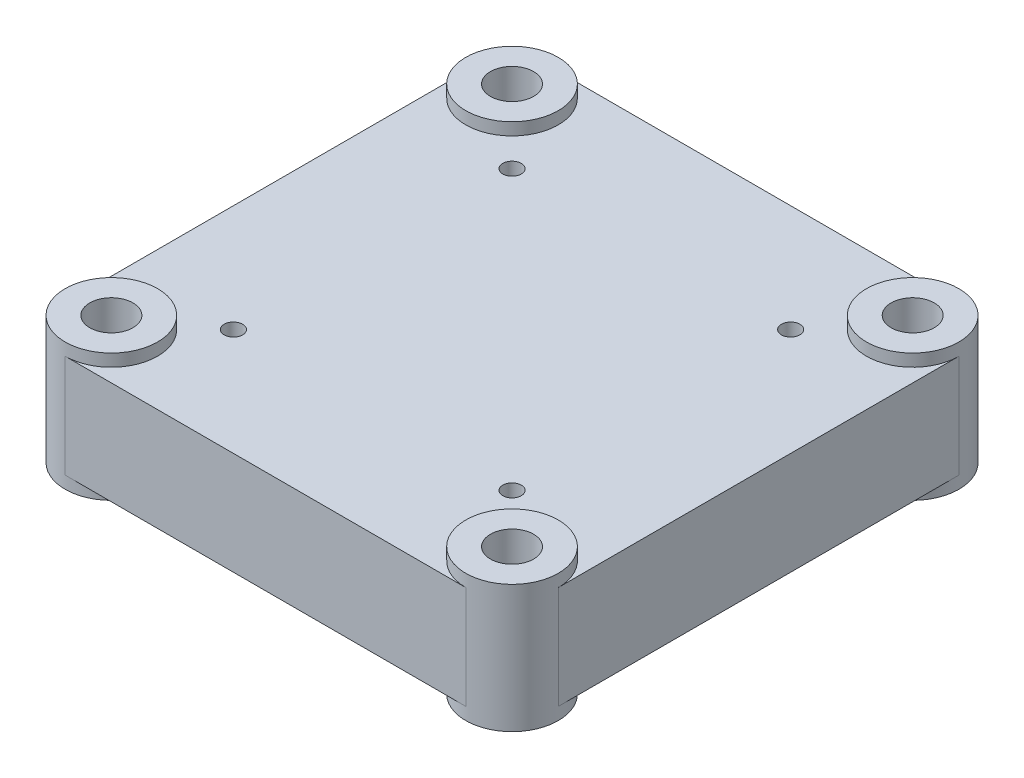
ISO-10303-21;
HEADER;
FILE_DESCRIPTION(('STEP AP214'),'2;1');
FILE_NAME('part.step','',(''),(''),'','','');
FILE_SCHEMA(('AUTOMOTIVE_DESIGN { 1 0 10303 214 1 1 1 1 }'));
ENDSEC;
DATA;
#1=APPLICATION_CONTEXT('core data for automotive mechanical design processes');
#2=APPLICATION_PROTOCOL_DEFINITION('international standard','automotive_design',2000,#1);
#3=PRODUCT_CONTEXT('',#1,'mechanical');
#4=PRODUCT('Part','Part','',(#3));
#5=PRODUCT_RELATED_PRODUCT_CATEGORY('part','',(#4));
#6=PRODUCT_DEFINITION_FORMATION('','',#4);
#7=PRODUCT_DEFINITION_CONTEXT('part definition',#1,'design');
#8=PRODUCT_DEFINITION('design','',#6,#7);
#9=PRODUCT_DEFINITION_SHAPE('','',#8);
#10=(LENGTH_UNIT() NAMED_UNIT(*) SI_UNIT(.MILLI.,.METRE.));
#11=(NAMED_UNIT(*) PLANE_ANGLE_UNIT() SI_UNIT($,.RADIAN.));
#12=(NAMED_UNIT(*) SI_UNIT($,.STERADIAN.) SOLID_ANGLE_UNIT());
#13=UNCERTAINTY_MEASURE_WITH_UNIT(LENGTH_MEASURE(1.E-05),#10,'distance_accuracy_value','');
#14=(GEOMETRIC_REPRESENTATION_CONTEXT(3) GLOBAL_UNCERTAINTY_ASSIGNED_CONTEXT((#13)) GLOBAL_UNIT_ASSIGNED_CONTEXT((#10,
#11,#12)) REPRESENTATION_CONTEXT('',''));
#15=CARTESIAN_POINT('',(0.,0.,0.));
#16=DIRECTION('',(0.,0.,1.));
#17=DIRECTION('',(1.,0.,0.));
#18=AXIS2_PLACEMENT_3D('',#15,#16,#17);
#19=CARTESIAN_POINT('',(-32.5,0.,32.5));
#20=DIRECTION('',(0.,-1.,0.));
#21=DIRECTION('',(0.,0.,-1.));
#22=AXIS2_PLACEMENT_3D('',#19,#20,#21);
#23=PLANE('',#22);
#24=CARTESIAN_POINT('',(0.,0.,0.));
#25=DIRECTION('',(0.,-1.,0.));
#26=DIRECTION('',(0.,0.,-1.));
#27=AXIS2_PLACEMENT_3D('',#24,#25,#26);
#28=CIRCLE('',#27,17.4);
#29=CARTESIAN_POINT('',(0.,0.,-17.4));
#30=VERTEX_POINT('',#29);
#31=EDGE_CURVE('E227',#30,#30,#28,.T.);
#32=ORIENTED_EDGE('',*,*,#31,.F.);
#33=EDGE_LOOP('',(#32));
#34=FACE_BOUND('',#33,.T.);
#35=CARTESIAN_POINT('',(-22.6005050633883,0.,-22.6005050633883));
#36=DIRECTION('',(0.,1.,0.));
#37=DIRECTION('',(0.,0.,1.));
#38=AXIS2_PLACEMENT_3D('',#35,#36,#37);
#39=CIRCLE('',#38,1.5);
#40=CARTESIAN_POINT('',(-22.6005050633883,0.,-21.1005050633883));
#41=VERTEX_POINT('',#40);
#42=EDGE_CURVE('E187',#41,#41,#39,.T.);
#43=ORIENTED_EDGE('',*,*,#42,.T.);
#44=EDGE_LOOP('',(#43));
#45=FACE_BOUND('',#44,.T.);
#46=CARTESIAN_POINT('',(22.6005050633883,0.,22.6005050633883));
#47=DIRECTION('',(0.,1.,0.));
#48=DIRECTION('',(0.,0.,1.));
#49=AXIS2_PLACEMENT_3D('',#46,#47,#48);
#50=CIRCLE('',#49,1.5);
#51=CARTESIAN_POINT('',(22.6005050633883,0.,24.1005050633883));
#52=VERTEX_POINT('',#51);
#53=EDGE_CURVE('E167',#52,#52,#50,.T.);
#54=ORIENTED_EDGE('',*,*,#53,.T.);
#55=EDGE_LOOP('',(#54));
#56=FACE_BOUND('',#55,.T.);
#57=CARTESIAN_POINT('',(-22.6005050633883,0.,22.6005050633883));
#58=DIRECTION('',(0.,1.,0.));
#59=DIRECTION('',(0.,0.,-1.));
#60=AXIS2_PLACEMENT_3D('',#57,#58,#59);
#61=CIRCLE('',#60,1.5);
#62=CARTESIAN_POINT('',(-22.6005050633883,0.,21.1005050633883));
#63=VERTEX_POINT('',#62);
#64=EDGE_CURVE('E181',#63,#63,#61,.T.);
#65=ORIENTED_EDGE('',*,*,#64,.T.);
#66=EDGE_LOOP('',(#65));
#67=FACE_BOUND('',#66,.T.);
#68=CARTESIAN_POINT('',(22.6005050633883,0.,-22.6005050633883));
#69=DIRECTION('',(0.,1.,0.));
#70=DIRECTION('',(0.,0.,-1.));
#71=AXIS2_PLACEMENT_3D('',#68,#69,#70);
#72=CIRCLE('',#71,1.5);
#73=CARTESIAN_POINT('',(22.6005050633883,0.,-24.1005050633883));
#74=VERTEX_POINT('',#73);
#75=EDGE_CURVE('E193',#74,#74,#72,.T.);
#76=ORIENTED_EDGE('',*,*,#75,.T.);
#77=EDGE_LOOP('',(#76));
#78=FACE_BOUND('',#77,.T.);
#79=DIRECTION('',(0.,0.,1.));
#80=VECTOR('',#79,1.);
#81=CARTESIAN_POINT('',(-40.,0.,32.5));
#82=LINE('',#81,#80);
#83=CARTESIAN_POINT('',(-40.,0.,-32.4999999999999));
#84=VERTEX_POINT('',#83);
#85=CARTESIAN_POINT('',(-40.,0.,32.5));
#86=VERTEX_POINT('',#85);
#87=EDGE_CURVE('E114',#84,#86,#82,.T.);
#88=ORIENTED_EDGE('',*,*,#87,.F.);
#89=CARTESIAN_POINT('',(-32.5,0.,-32.5));
#90=DIRECTION('',(0.,-1.,0.));
#91=DIRECTION('',(0.,0.,-1.));
#92=AXIS2_PLACEMENT_3D('',#89,#90,#91);
#93=CIRCLE('',#92,7.5);
#94=CARTESIAN_POINT('',(-32.5,0.,-40.));
#95=VERTEX_POINT('',#94);
#96=EDGE_CURVE('E80',#95,#84,#93,.T.);
#97=ORIENTED_EDGE('',*,*,#96,.F.);
#98=DIRECTION('',(-1.,0.,0.));
#99=VECTOR('',#98,1.);
#100=CARTESIAN_POINT('',(-32.5,0.,-40.));
#101=LINE('',#100,#99);
#102=CARTESIAN_POINT('',(32.4999999999999,0.,-40.));
#103=VERTEX_POINT('',#102);
#104=EDGE_CURVE('E112',#103,#95,#101,.T.);
#105=ORIENTED_EDGE('',*,*,#104,.F.);
#106=CARTESIAN_POINT('',(32.5,0.,-32.5));
#107=DIRECTION('',(0.,-1.,0.));
#108=DIRECTION('',(0.,0.,-1.));
#109=AXIS2_PLACEMENT_3D('',#106,#107,#108);
#110=CIRCLE('',#109,7.5);
#111=CARTESIAN_POINT('',(40.,0.,-32.4999999999999));
#112=VERTEX_POINT('',#111);
#113=EDGE_CURVE('E72',#112,#103,#110,.T.);
#114=ORIENTED_EDGE('',*,*,#113,.F.);
#115=DIRECTION('',(0.,0.,-1.));
#116=VECTOR('',#115,1.);
#117=CARTESIAN_POINT('',(40.,0.,32.5));
#118=LINE('',#117,#116);
#119=CARTESIAN_POINT('',(40.,0.,32.5));
#120=VERTEX_POINT('',#119);
#121=EDGE_CURVE('E125',#120,#112,#118,.T.);
#122=ORIENTED_EDGE('',*,*,#121,.F.);
#123=CARTESIAN_POINT('',(32.5,0.,32.5));
#124=DIRECTION('',(0.,-1.,0.));
#125=DIRECTION('',(0.,0.,-1.));
#126=AXIS2_PLACEMENT_3D('',#123,#124,#125);
#127=CIRCLE('',#126,7.5);
#128=CARTESIAN_POINT('',(32.4999999999999,0.,40.));
#129=VERTEX_POINT('',#128);
#130=EDGE_CURVE('E161',#129,#120,#127,.T.);
#131=ORIENTED_EDGE('',*,*,#130,.F.);
#132=DIRECTION('',(1.,0.,0.));
#133=VECTOR('',#132,1.);
#134=CARTESIAN_POINT('',(-32.5,0.,40.));
#135=LINE('',#134,#133);
#136=CARTESIAN_POINT('',(-32.5,0.,40.));
#137=VERTEX_POINT('',#136);
#138=EDGE_CURVE('E150',#137,#129,#135,.T.);
#139=ORIENTED_EDGE('',*,*,#138,.F.);
#140=CARTESIAN_POINT('',(-32.5,0.,32.5));
#141=DIRECTION('',(0.,-1.,0.));
#142=DIRECTION('',(0.,0.,-1.));
#143=AXIS2_PLACEMENT_3D('',#140,#141,#142);
#144=CIRCLE('',#143,7.5);
#145=EDGE_CURVE('E156',#86,#137,#144,.T.);
#146=ORIENTED_EDGE('',*,*,#145,.F.);
#147=EDGE_LOOP('',(#88,#97,#105,#114,#122,#131,#139,#146));
#148=FACE_BOUND('',#147,.T.);
#149=ADVANCED_FACE('F35',(#34,#45,#56,#67,#78,#148),#23,.T.);
#150=CARTESIAN_POINT('',(-32.5,16.7,32.5));
#151=DIRECTION('',(0.,-1.,0.));
#152=DIRECTION('',(0.,0.,-1.));
#153=AXIS2_PLACEMENT_3D('',#150,#151,#152);
#154=PLANE('',#153);
#155=DIRECTION('',(-1.,0.,0.));
#156=VECTOR('',#155,1.);
#157=CARTESIAN_POINT('',(-32.5,16.7,-40.));
#158=LINE('',#157,#156);
#159=CARTESIAN_POINT('',(32.4999999999999,16.7,-40.));
#160=VERTEX_POINT('',#159);
#161=CARTESIAN_POINT('',(-32.5,16.7,-40.));
#162=VERTEX_POINT('',#161);
#163=EDGE_CURVE('E172',#160,#162,#158,.T.);
#164=ORIENTED_EDGE('',*,*,#163,.T.);
#165=CARTESIAN_POINT('',(-32.5,16.7,-32.5));
#166=DIRECTION('',(0.,-1.,0.));
#167=DIRECTION('',(0.,0.,-1.));
#168=AXIS2_PLACEMENT_3D('',#165,#166,#167);
#169=CIRCLE('',#168,7.5);
#170=CARTESIAN_POINT('',(-40.,16.7,-32.5));
#171=VERTEX_POINT('',#170);
#172=EDGE_CURVE('E129',#162,#171,#169,.T.);
#173=ORIENTED_EDGE('',*,*,#172,.T.);
#174=DIRECTION('',(0.,0.,1.));
#175=VECTOR('',#174,1.);
#176=CARTESIAN_POINT('',(-40.,16.7,32.5));
#177=LINE('',#176,#175);
#178=CARTESIAN_POINT('',(-40.,16.7,32.5));
#179=VERTEX_POINT('',#178);
#180=EDGE_CURVE('E53',#171,#179,#177,.T.);
#181=ORIENTED_EDGE('',*,*,#180,.T.);
#182=CARTESIAN_POINT('',(-32.5,16.7,32.5));
#183=DIRECTION('',(0.,-1.,0.));
#184=DIRECTION('',(0.,0.,-1.));
#185=AXIS2_PLACEMENT_3D('',#182,#183,#184);
#186=CIRCLE('',#185,7.5);
#187=CARTESIAN_POINT('',(-32.5,16.7,40.));
#188=VERTEX_POINT('',#187);
#189=EDGE_CURVE('E155',#179,#188,#186,.T.);
#190=ORIENTED_EDGE('',*,*,#189,.T.);
#191=DIRECTION('',(1.,0.,0.));
#192=VECTOR('',#191,1.);
#193=CARTESIAN_POINT('',(-32.5,16.7,40.));
#194=LINE('',#193,#192);
#195=CARTESIAN_POINT('',(32.4999999999999,16.7,40.));
#196=VERTEX_POINT('',#195);
#197=EDGE_CURVE('E86',#188,#196,#194,.T.);
#198=ORIENTED_EDGE('',*,*,#197,.T.);
#199=CARTESIAN_POINT('',(32.5,16.7,32.5));
#200=DIRECTION('',(0.,-1.,0.));
#201=DIRECTION('',(0.,0.,-1.));
#202=AXIS2_PLACEMENT_3D('',#199,#200,#201);
#203=CIRCLE('',#202,7.5);
#204=CARTESIAN_POINT('',(40.,16.7,32.5));
#205=VERTEX_POINT('',#204);
#206=EDGE_CURVE('E205',#196,#205,#203,.T.);
#207=ORIENTED_EDGE('',*,*,#206,.T.);
#208=DIRECTION('',(0.,0.,-1.));
#209=VECTOR('',#208,1.);
#210=CARTESIAN_POINT('',(40.,16.7,32.5));
#211=LINE('',#210,#209);
#212=CARTESIAN_POINT('',(40.,16.7,-32.5));
#213=VERTEX_POINT('',#212);
#214=EDGE_CURVE('E173',#205,#213,#211,.T.);
#215=ORIENTED_EDGE('',*,*,#214,.T.);
#216=CARTESIAN_POINT('',(32.5,16.7,-32.5));
#217=DIRECTION('',(0.,-1.,0.));
#218=DIRECTION('',(0.,0.,-1.));
#219=AXIS2_PLACEMENT_3D('',#216,#217,#218);
#220=CIRCLE('',#219,7.5);
#221=EDGE_CURVE('E11',#213,#160,#220,.T.);
#222=ORIENTED_EDGE('',*,*,#221,.T.);
#223=EDGE_LOOP('',(#164,#173,#181,#190,#198,#207,#215,#222));
#224=FACE_BOUND('',#223,.T.);
#225=CARTESIAN_POINT('',(22.6005050633883,16.7,22.6005050633883));
#226=DIRECTION('',(0.,1.,0.));
#227=DIRECTION('',(0.,0.,1.));
#228=AXIS2_PLACEMENT_3D('',#225,#226,#227);
#229=CIRCLE('',#228,1.5);
#230=CARTESIAN_POINT('',(22.6005050633883,16.7,24.1005050633883));
#231=VERTEX_POINT('',#230);
#232=EDGE_CURVE('E162',#231,#231,#229,.T.);
#233=ORIENTED_EDGE('',*,*,#232,.F.);
#234=EDGE_LOOP('',(#233));
#235=FACE_BOUND('',#234,.T.);
#236=CARTESIAN_POINT('',(-22.6005050633883,16.7,22.6005050633883));
#237=DIRECTION('',(0.,1.,0.));
#238=DIRECTION('',(0.,0.,-1.));
#239=AXIS2_PLACEMENT_3D('',#236,#237,#238);
#240=CIRCLE('',#239,1.5);
#241=CARTESIAN_POINT('',(-22.6005050633883,16.7,21.1005050633883));
#242=VERTEX_POINT('',#241);
#243=EDGE_CURVE('E179',#242,#242,#240,.T.);
#244=ORIENTED_EDGE('',*,*,#243,.F.);
#245=EDGE_LOOP('',(#244));
#246=FACE_BOUND('',#245,.T.);
#247=CARTESIAN_POINT('',(-22.6005050633883,16.7,-22.6005050633883));
#248=DIRECTION('',(0.,1.,0.));
#249=DIRECTION('',(0.,0.,1.));
#250=AXIS2_PLACEMENT_3D('',#247,#248,#249);
#251=CIRCLE('',#250,1.5);
#252=CARTESIAN_POINT('',(-22.6005050633883,16.7,-21.1005050633883));
#253=VERTEX_POINT('',#252);
#254=EDGE_CURVE('E184',#253,#253,#251,.T.);
#255=ORIENTED_EDGE('',*,*,#254,.F.);
#256=EDGE_LOOP('',(#255));
#257=FACE_BOUND('',#256,.T.);
#258=CARTESIAN_POINT('',(22.6005050633883,16.7,-22.6005050633883));
#259=DIRECTION('',(0.,1.,0.));
#260=DIRECTION('',(0.,0.,-1.));
#261=AXIS2_PLACEMENT_3D('',#258,#259,#260);
#262=CIRCLE('',#261,1.5);
#263=CARTESIAN_POINT('',(22.6005050633883,16.7,-24.1005050633883));
#264=VERTEX_POINT('',#263);
#265=EDGE_CURVE('E190',#264,#264,#262,.T.);
#266=ORIENTED_EDGE('',*,*,#265,.F.);
#267=EDGE_LOOP('',(#266));
#268=FACE_BOUND('',#267,.T.);
#269=ADVANCED_FACE('F269',(#224,#235,#246,#257,#268),#154,.F.);
#270=CARTESIAN_POINT('',(-32.5,16.7,32.5));
#271=DIRECTION('',(0.,-1.,0.));
#272=DIRECTION('',(0.,0.,-1.));
#273=AXIS2_PLACEMENT_3D('',#270,#271,#272);
#274=CYLINDRICAL_SURFACE('',#273,7.5);
#275=DIRECTION('',(0.,-1.,0.));
#276=VECTOR('',#275,1.);
#277=CARTESIAN_POINT('',(-40.,16.7,32.5));
#278=LINE('',#277,#276);
#279=EDGE_CURVE('E134',#179,#86,#278,.T.);
#280=ORIENTED_EDGE('',*,*,#279,.T.);
#281=ORIENTED_EDGE('',*,*,#145,.T.);
#282=DIRECTION('',(0.,-1.,0.));
#283=VECTOR('',#282,1.);
#284=CARTESIAN_POINT('',(-32.5,16.7,40.));
#285=LINE('',#284,#283);
#286=EDGE_CURVE('E39',#188,#137,#285,.T.);
#287=ORIENTED_EDGE('',*,*,#286,.F.);
#288=ORIENTED_EDGE('',*,*,#189,.F.);
#289=EDGE_LOOP('',(#280,#281,#287,#288));
#290=FACE_BOUND('',#289,.T.);
#291=CARTESIAN_POINT('',(-32.5,18.7,32.5));
#292=DIRECTION('',(0.,-1.,0.));
#293=DIRECTION('',(0.,0.,-1.));
#294=AXIS2_PLACEMENT_3D('',#291,#292,#293);
#295=CIRCLE('',#294,7.5);
#296=CARTESIAN_POINT('',(-32.5,18.7,25.));
#297=VERTEX_POINT('',#296);
#298=EDGE_CURVE('E212',#297,#297,#295,.T.);
#299=ORIENTED_EDGE('',*,*,#298,.T.);
#300=EDGE_LOOP('',(#299));
#301=FACE_BOUND('',#300,.T.);
#302=CARTESIAN_POINT('',(-32.5,-2.,32.5));
#303=DIRECTION('',(0.,-1.,0.));
#304=DIRECTION('',(0.,0.,-1.));
#305=AXIS2_PLACEMENT_3D('',#302,#303,#304);
#306=CIRCLE('',#305,7.5);
#307=CARTESIAN_POINT('',(-32.5,-2.,25.));
#308=VERTEX_POINT('',#307);
#309=EDGE_CURVE('E157',#308,#308,#306,.T.);
#310=ORIENTED_EDGE('',*,*,#309,.F.);
#311=EDGE_LOOP('',(#310));
#312=FACE_BOUND('',#311,.T.);
#313=ADVANCED_FACE('F37',(#290,#301,#312),#274,.T.);
#314=CARTESIAN_POINT('',(-32.5,16.7,40.));
#315=DIRECTION('',(0.,0.,-1.));
#316=DIRECTION('',(-1.,0.,0.));
#317=AXIS2_PLACEMENT_3D('',#314,#315,#316);
#318=PLANE('',#317);
#319=ORIENTED_EDGE('',*,*,#138,.T.);
#320=DIRECTION('',(0.,-1.,0.));
#321=VECTOR('',#320,1.);
#322=CARTESIAN_POINT('',(32.4999999999999,16.7,40.));
#323=LINE('',#322,#321);
#324=EDGE_CURVE('E141',#196,#129,#323,.T.);
#325=ORIENTED_EDGE('',*,*,#324,.F.);
#326=ORIENTED_EDGE('',*,*,#197,.F.);
#327=ORIENTED_EDGE('',*,*,#286,.T.);
#328=EDGE_LOOP('',(#319,#325,#326,#327));
#329=FACE_BOUND('',#328,.T.);
#330=ADVANCED_FACE('F148',(#329),#318,.F.);
#331=CARTESIAN_POINT('',(32.5,16.7,32.5));
#332=DIRECTION('',(0.,-1.,0.));
#333=DIRECTION('',(0.,0.,-1.));
#334=AXIS2_PLACEMENT_3D('',#331,#332,#333);
#335=CYLINDRICAL_SURFACE('',#334,7.5);
#336=ORIENTED_EDGE('',*,*,#324,.T.);
#337=ORIENTED_EDGE('',*,*,#130,.T.);
#338=DIRECTION('',(0.,-1.,0.));
#339=VECTOR('',#338,1.);
#340=CARTESIAN_POINT('',(40.,16.7,32.5));
#341=LINE('',#340,#339);
#342=EDGE_CURVE('E139',#205,#120,#341,.T.);
#343=ORIENTED_EDGE('',*,*,#342,.F.);
#344=ORIENTED_EDGE('',*,*,#206,.F.);
#345=EDGE_LOOP('',(#336,#337,#343,#344));
#346=FACE_BOUND('',#345,.T.);
#347=CARTESIAN_POINT('',(32.5,18.7,32.5));
#348=DIRECTION('',(0.,-1.,0.));
#349=DIRECTION('',(0.,0.,-1.));
#350=AXIS2_PLACEMENT_3D('',#347,#348,#349);
#351=CIRCLE('',#350,7.5);
#352=CARTESIAN_POINT('',(32.5,18.7,25.));
#353=VERTEX_POINT('',#352);
#354=EDGE_CURVE('E204',#353,#353,#351,.T.);
#355=ORIENTED_EDGE('',*,*,#354,.T.);
#356=EDGE_LOOP('',(#355));
#357=FACE_BOUND('',#356,.T.);
#358=CARTESIAN_POINT('',(32.5,-2.,32.5));
#359=DIRECTION('',(0.,-1.,0.));
#360=DIRECTION('',(0.,0.,-1.));
#361=AXIS2_PLACEMENT_3D('',#358,#359,#360);
#362=CIRCLE('',#361,7.5);
#363=CARTESIAN_POINT('',(32.5,-2.,25.));
#364=VERTEX_POINT('',#363);
#365=EDGE_CURVE('E239',#364,#364,#362,.T.);
#366=ORIENTED_EDGE('',*,*,#365,.F.);
#367=EDGE_LOOP('',(#366));
#368=FACE_BOUND('',#367,.T.);
#369=ADVANCED_FACE('F295',(#346,#357,#368),#335,.T.);
#370=CARTESIAN_POINT('',(40.,16.7,32.5));
#371=DIRECTION('',(-1.,0.,0.));
#372=DIRECTION('',(0.,0.,1.));
#373=AXIS2_PLACEMENT_3D('',#370,#371,#372);
#374=PLANE('',#373);
#375=ORIENTED_EDGE('',*,*,#121,.T.);
#376=DIRECTION('',(0.,-1.,0.));
#377=VECTOR('',#376,1.);
#378=CARTESIAN_POINT('',(40.,16.7,-32.4999999999999));
#379=LINE('',#378,#377);
#380=EDGE_CURVE('E132',#213,#112,#379,.T.);
#381=ORIENTED_EDGE('',*,*,#380,.F.);
#382=ORIENTED_EDGE('',*,*,#214,.F.);
#383=ORIENTED_EDGE('',*,*,#342,.T.);
#384=EDGE_LOOP('',(#375,#381,#382,#383));
#385=FACE_BOUND('',#384,.T.);
#386=ADVANCED_FACE('F292',(#385),#374,.F.);
#387=CARTESIAN_POINT('',(32.5,16.7,-32.5));
#388=DIRECTION('',(0.,-1.,0.));
#389=DIRECTION('',(0.,0.,-1.));
#390=AXIS2_PLACEMENT_3D('',#387,#388,#389);
#391=CYLINDRICAL_SURFACE('',#390,7.5);
#392=ORIENTED_EDGE('',*,*,#380,.T.);
#393=ORIENTED_EDGE('',*,*,#113,.T.);
#394=DIRECTION('',(0.,-1.,0.));
#395=VECTOR('',#394,1.);
#396=CARTESIAN_POINT('',(32.4999999999999,16.7,-40.));
#397=LINE('',#396,#395);
#398=EDGE_CURVE('E124',#160,#103,#397,.T.);
#399=ORIENTED_EDGE('',*,*,#398,.F.);
#400=ORIENTED_EDGE('',*,*,#221,.F.);
#401=EDGE_LOOP('',(#392,#393,#399,#400));
#402=FACE_BOUND('',#401,.T.);
#403=CARTESIAN_POINT('',(32.5,18.7,-32.5));
#404=DIRECTION('',(0.,-1.,0.));
#405=DIRECTION('',(0.,0.,-1.));
#406=AXIS2_PLACEMENT_3D('',#403,#404,#405);
#407=CIRCLE('',#406,7.5);
#408=CARTESIAN_POINT('',(32.5,18.7,-40.));
#409=VERTEX_POINT('',#408);
#410=EDGE_CURVE('E196',#409,#409,#407,.T.);
#411=ORIENTED_EDGE('',*,*,#410,.T.);
#412=EDGE_LOOP('',(#411));
#413=FACE_BOUND('',#412,.T.);
#414=CARTESIAN_POINT('',(32.5,-2.,-32.5));
#415=DIRECTION('',(0.,-1.,0.));
#416=DIRECTION('',(0.,0.,-1.));
#417=AXIS2_PLACEMENT_3D('',#414,#415,#416);
#418=CIRCLE('',#417,7.5);
#419=CARTESIAN_POINT('',(32.5,-2.,-40.));
#420=VERTEX_POINT('',#419);
#421=EDGE_CURVE('E230',#420,#420,#418,.T.);
#422=ORIENTED_EDGE('',*,*,#421,.F.);
#423=EDGE_LOOP('',(#422));
#424=FACE_BOUND('',#423,.T.);
#425=ADVANCED_FACE('F289',(#402,#413,#424),#391,.T.);
#426=CARTESIAN_POINT('',(-32.5,16.7,-40.));
#427=DIRECTION('',(0.,0.,1.));
#428=DIRECTION('',(1.,0.,0.));
#429=AXIS2_PLACEMENT_3D('',#426,#427,#428);
#430=PLANE('',#429);
#431=ORIENTED_EDGE('',*,*,#104,.T.);
#432=DIRECTION('',(0.,-1.,0.));
#433=VECTOR('',#432,1.);
#434=CARTESIAN_POINT('',(-32.5,16.7,-40.));
#435=LINE('',#434,#433);
#436=EDGE_CURVE('E122',#162,#95,#435,.T.);
#437=ORIENTED_EDGE('',*,*,#436,.F.);
#438=ORIENTED_EDGE('',*,*,#163,.F.);
#439=ORIENTED_EDGE('',*,*,#398,.T.);
#440=EDGE_LOOP('',(#431,#437,#438,#439));
#441=FACE_BOUND('',#440,.T.);
#442=ADVANCED_FACE('F120',(#441),#430,.F.);
#443=CARTESIAN_POINT('',(-32.5,16.7,-32.5));
#444=DIRECTION('',(0.,-1.,0.));
#445=DIRECTION('',(0.,0.,-1.));
#446=AXIS2_PLACEMENT_3D('',#443,#444,#445);
#447=CYLINDRICAL_SURFACE('',#446,7.5);
#448=ORIENTED_EDGE('',*,*,#436,.T.);
#449=ORIENTED_EDGE('',*,*,#96,.T.);
#450=DIRECTION('',(0.,-1.,0.));
#451=VECTOR('',#450,1.);
#452=CARTESIAN_POINT('',(-40.,16.7,-32.4999999999999));
#453=LINE('',#452,#451);
#454=EDGE_CURVE('E130',#171,#84,#453,.T.);
#455=ORIENTED_EDGE('',*,*,#454,.F.);
#456=ORIENTED_EDGE('',*,*,#172,.F.);
#457=EDGE_LOOP('',(#448,#449,#455,#456));
#458=FACE_BOUND('',#457,.T.);
#459=CARTESIAN_POINT('',(-32.5,18.7,-32.5));
#460=DIRECTION('',(0.,-1.,0.));
#461=DIRECTION('',(0.,0.,-1.));
#462=AXIS2_PLACEMENT_3D('',#459,#460,#461);
#463=CIRCLE('',#462,7.5);
#464=CARTESIAN_POINT('',(-32.5,18.7,-40.));
#465=VERTEX_POINT('',#464);
#466=EDGE_CURVE('E219',#465,#465,#463,.T.);
#467=ORIENTED_EDGE('',*,*,#466,.T.);
#468=EDGE_LOOP('',(#467));
#469=FACE_BOUND('',#468,.T.);
#470=CARTESIAN_POINT('',(-32.5,-2.,-32.5));
#471=DIRECTION('',(0.,-1.,0.));
#472=DIRECTION('',(0.,0.,-1.));
#473=AXIS2_PLACEMENT_3D('',#470,#471,#472);
#474=CIRCLE('',#473,7.5);
#475=CARTESIAN_POINT('',(-32.5,-2.,-40.));
#476=VERTEX_POINT('',#475);
#477=EDGE_CURVE('E115',#476,#476,#474,.T.);
#478=ORIENTED_EDGE('',*,*,#477,.F.);
#479=EDGE_LOOP('',(#478));
#480=FACE_BOUND('',#479,.T.);
#481=ADVANCED_FACE('F127',(#458,#469,#480),#447,.T.);
#482=CARTESIAN_POINT('',(-40.,16.7,32.5));
#483=DIRECTION('',(1.,0.,0.));
#484=DIRECTION('',(0.,0.,-1.));
#485=AXIS2_PLACEMENT_3D('',#482,#483,#484);
#486=PLANE('',#485);
#487=ORIENTED_EDGE('',*,*,#87,.T.);
#488=ORIENTED_EDGE('',*,*,#279,.F.);
#489=ORIENTED_EDGE('',*,*,#180,.F.);
#490=ORIENTED_EDGE('',*,*,#454,.T.);
#491=EDGE_LOOP('',(#487,#488,#489,#490));
#492=FACE_BOUND('',#491,.T.);
#493=ADVANCED_FACE('F280',(#492),#486,.F.);
#494=CARTESIAN_POINT('',(32.5,16.7,-32.5));
#495=DIRECTION('',(0.,-1.,0.));
#496=DIRECTION('',(0.,0.,-1.));
#497=AXIS2_PLACEMENT_3D('',#494,#495,#496);
#498=CYLINDRICAL_SURFACE('',#497,3.5);
#499=CARTESIAN_POINT('',(32.5,18.7,-32.5));
#500=DIRECTION('',(0.,-1.,0.));
#501=DIRECTION('',(0.,0.,-1.));
#502=AXIS2_PLACEMENT_3D('',#499,#500,#501);
#503=CIRCLE('',#502,3.50000000000001);
#504=CARTESIAN_POINT('',(32.5,18.7,-36.));
#505=VERTEX_POINT('',#504);
#506=EDGE_CURVE('E201',#505,#505,#503,.T.);
#507=ORIENTED_EDGE('',*,*,#506,.F.);
#508=EDGE_LOOP('',(#507));
#509=FACE_BOUND('',#508,.T.);
#510=CARTESIAN_POINT('',(32.5,-2.,-32.5));
#511=DIRECTION('',(0.,-1.,0.));
#512=DIRECTION('',(0.,0.,-1.));
#513=AXIS2_PLACEMENT_3D('',#510,#511,#512);
#514=CIRCLE('',#513,3.50000000000001);
#515=CARTESIAN_POINT('',(32.5,-2.,-36.));
#516=VERTEX_POINT('',#515);
#517=EDGE_CURVE('E234',#516,#516,#514,.T.);
#518=ORIENTED_EDGE('',*,*,#517,.T.);
#519=EDGE_LOOP('',(#518));
#520=FACE_BOUND('',#519,.T.);
#521=ADVANCED_FACE('F283',(#509,#520),#498,.F.);
#522=CARTESIAN_POINT('',(-32.5,16.7,32.5));
#523=DIRECTION('',(0.,-1.,0.));
#524=DIRECTION('',(0.,0.,-1.));
#525=AXIS2_PLACEMENT_3D('',#522,#523,#524);
#526=CYLINDRICAL_SURFACE('',#525,3.49999999999998);
#527=CARTESIAN_POINT('',(-32.5,18.7,32.5));
#528=DIRECTION('',(0.,-1.,0.));
#529=DIRECTION('',(0.,0.,-1.));
#530=AXIS2_PLACEMENT_3D('',#527,#528,#529);
#531=CIRCLE('',#530,3.50000000000001);
#532=CARTESIAN_POINT('',(-32.5,18.7,29.));
#533=VERTEX_POINT('',#532);
#534=EDGE_CURVE('E214',#533,#533,#531,.T.);
#535=ORIENTED_EDGE('',*,*,#534,.F.);
#536=EDGE_LOOP('',(#535));
#537=FACE_BOUND('',#536,.T.);
#538=CARTESIAN_POINT('',(-32.5,-2.,32.5));
#539=DIRECTION('',(0.,-1.,0.));
#540=DIRECTION('',(0.,0.,-1.));
#541=AXIS2_PLACEMENT_3D('',#538,#539,#540);
#542=CIRCLE('',#541,3.50000000000001);
#543=CARTESIAN_POINT('',(-32.5,-2.,29.));
#544=VERTEX_POINT('',#543);
#545=EDGE_CURVE('E158',#544,#544,#542,.T.);
#546=ORIENTED_EDGE('',*,*,#545,.T.);
#547=EDGE_LOOP('',(#546));
#548=FACE_BOUND('',#547,.T.);
#549=ADVANCED_FACE('F428',(#537,#548),#526,.F.);
#550=CARTESIAN_POINT('',(-32.5,16.7,-32.5));
#551=DIRECTION('',(0.,-1.,0.));
#552=DIRECTION('',(0.,0.,-1.));
#553=AXIS2_PLACEMENT_3D('',#550,#551,#552);
#554=CYLINDRICAL_SURFACE('',#553,3.5);
#555=CARTESIAN_POINT('',(-32.5,18.7,-32.5));
#556=DIRECTION('',(0.,-1.,0.));
#557=DIRECTION('',(0.,0.,-1.));
#558=AXIS2_PLACEMENT_3D('',#555,#556,#557);
#559=CIRCLE('',#558,3.50000000000001);
#560=CARTESIAN_POINT('',(-32.5,18.7,-36.));
#561=VERTEX_POINT('',#560);
#562=EDGE_CURVE('E221',#561,#561,#559,.T.);
#563=ORIENTED_EDGE('',*,*,#562,.F.);
#564=EDGE_LOOP('',(#563));
#565=FACE_BOUND('',#564,.T.);
#566=CARTESIAN_POINT('',(-32.5,-2.,-32.5));
#567=DIRECTION('',(0.,-1.,0.));
#568=DIRECTION('',(0.,0.,-1.));
#569=AXIS2_PLACEMENT_3D('',#566,#567,#568);
#570=CIRCLE('',#569,3.50000000000001);
#571=CARTESIAN_POINT('',(-32.5,-2.,-36.));
#572=VERTEX_POINT('',#571);
#573=EDGE_CURVE('E116',#572,#572,#570,.T.);
#574=ORIENTED_EDGE('',*,*,#573,.T.);
#575=EDGE_LOOP('',(#574));
#576=FACE_BOUND('',#575,.T.);
#577=ADVANCED_FACE('F255',(#565,#576),#554,.F.);
#578=CARTESIAN_POINT('',(32.5,16.7,32.5));
#579=DIRECTION('',(0.,-1.,0.));
#580=DIRECTION('',(0.,0.,-1.));
#581=AXIS2_PLACEMENT_3D('',#578,#579,#580);
#582=CYLINDRICAL_SURFACE('',#581,3.50000000000001);
#583=CARTESIAN_POINT('',(32.5,18.7,32.5));
#584=DIRECTION('',(0.,-1.,0.));
#585=DIRECTION('',(0.,0.,-1.));
#586=AXIS2_PLACEMENT_3D('',#583,#584,#585);
#587=CIRCLE('',#586,3.50000000000001);
#588=CARTESIAN_POINT('',(32.5,18.7,29.));
#589=VERTEX_POINT('',#588);
#590=EDGE_CURVE('E207',#589,#589,#587,.T.);
#591=ORIENTED_EDGE('',*,*,#590,.F.);
#592=EDGE_LOOP('',(#591));
#593=FACE_BOUND('',#592,.T.);
#594=CARTESIAN_POINT('',(32.5,-2.,32.5));
#595=DIRECTION('',(0.,-1.,0.));
#596=DIRECTION('',(0.,0.,-1.));
#597=AXIS2_PLACEMENT_3D('',#594,#595,#596);
#598=CIRCLE('',#597,3.50000000000001);
#599=CARTESIAN_POINT('',(32.5,-2.,29.));
#600=VERTEX_POINT('',#599);
#601=EDGE_CURVE('E241',#600,#600,#598,.T.);
#602=ORIENTED_EDGE('',*,*,#601,.T.);
#603=EDGE_LOOP('',(#602));
#604=FACE_BOUND('',#603,.T.);
#605=ADVANCED_FACE('F452',(#593,#604),#582,.F.);
#606=CARTESIAN_POINT('',(22.6005050633883,16.7,22.6005050633883));
#607=DIRECTION('',(0.,-1.,0.));
#608=DIRECTION('',(0.,0.,-1.));
#609=AXIS2_PLACEMENT_3D('',#606,#607,#608);
#610=CYLINDRICAL_SURFACE('',#609,1.5);
#611=ORIENTED_EDGE('',*,*,#232,.T.);
#612=EDGE_LOOP('',(#611));
#613=FACE_BOUND('',#612,.T.);
#614=ORIENTED_EDGE('',*,*,#53,.F.);
#615=EDGE_LOOP('',(#614));
#616=FACE_BOUND('',#615,.T.);
#617=ADVANCED_FACE('F464',(#613,#616),#610,.F.);
#618=CARTESIAN_POINT('',(-22.6005050633883,16.7,22.6005050633883));
#619=DIRECTION('',(0.,-1.,0.));
#620=DIRECTION('',(0.,0.,-1.));
#621=AXIS2_PLACEMENT_3D('',#618,#619,#620);
#622=CYLINDRICAL_SURFACE('',#621,1.5);
#623=ORIENTED_EDGE('',*,*,#243,.T.);
#624=EDGE_LOOP('',(#623));
#625=FACE_BOUND('',#624,.T.);
#626=ORIENTED_EDGE('',*,*,#64,.F.);
#627=EDGE_LOOP('',(#626));
#628=FACE_BOUND('',#627,.T.);
#629=ADVANCED_FACE('F504',(#625,#628),#622,.F.);
#630=CARTESIAN_POINT('',(-22.6005050633883,16.7,-22.6005050633883));
#631=DIRECTION('',(0.,-1.,0.));
#632=DIRECTION('',(0.,0.,-1.));
#633=AXIS2_PLACEMENT_3D('',#630,#631,#632);
#634=CYLINDRICAL_SURFACE('',#633,1.5);
#635=ORIENTED_EDGE('',*,*,#254,.T.);
#636=EDGE_LOOP('',(#635));
#637=FACE_BOUND('',#636,.T.);
#638=ORIENTED_EDGE('',*,*,#42,.F.);
#639=EDGE_LOOP('',(#638));
#640=FACE_BOUND('',#639,.T.);
#641=ADVANCED_FACE('F500',(#637,#640),#634,.F.);
#642=CARTESIAN_POINT('',(22.6005050633883,16.7,-22.6005050633883));
#643=DIRECTION('',(0.,-1.,0.));
#644=DIRECTION('',(0.,0.,-1.));
#645=AXIS2_PLACEMENT_3D('',#642,#643,#644);
#646=CYLINDRICAL_SURFACE('',#645,1.5);
#647=ORIENTED_EDGE('',*,*,#265,.T.);
#648=EDGE_LOOP('',(#647));
#649=FACE_BOUND('',#648,.T.);
#650=ORIENTED_EDGE('',*,*,#75,.F.);
#651=EDGE_LOOP('',(#650));
#652=FACE_BOUND('',#651,.T.);
#653=ADVANCED_FACE('F315',(#649,#652),#646,.F.);
#654=CARTESIAN_POINT('',(32.5,18.7,-32.5));
#655=DIRECTION('',(0.,-1.,0.));
#656=DIRECTION('',(0.,0.,-1.));
#657=AXIS2_PLACEMENT_3D('',#654,#655,#656);
#658=PLANE('',#657);
#659=ORIENTED_EDGE('',*,*,#506,.T.);
#660=EDGE_LOOP('',(#659));
#661=FACE_BOUND('',#660,.T.);
#662=ORIENTED_EDGE('',*,*,#410,.F.);
#663=EDGE_LOOP('',(#662));
#664=FACE_BOUND('',#663,.T.);
#665=ADVANCED_FACE('F320',(#661,#664),#658,.F.);
#666=CARTESIAN_POINT('',(32.5,18.7,32.5));
#667=DIRECTION('',(0.,-1.,0.));
#668=DIRECTION('',(0.,0.,-1.));
#669=AXIS2_PLACEMENT_3D('',#666,#667,#668);
#670=PLANE('',#669);
#671=ORIENTED_EDGE('',*,*,#590,.T.);
#672=EDGE_LOOP('',(#671));
#673=FACE_BOUND('',#672,.T.);
#674=ORIENTED_EDGE('',*,*,#354,.F.);
#675=EDGE_LOOP('',(#674));
#676=FACE_BOUND('',#675,.T.);
#677=ADVANCED_FACE('F325',(#673,#676),#670,.F.);
#678=CARTESIAN_POINT('',(-32.5,18.7,32.5));
#679=DIRECTION('',(0.,-1.,0.));
#680=DIRECTION('',(0.,0.,-1.));
#681=AXIS2_PLACEMENT_3D('',#678,#679,#680);
#682=PLANE('',#681);
#683=ORIENTED_EDGE('',*,*,#534,.T.);
#684=EDGE_LOOP('',(#683));
#685=FACE_BOUND('',#684,.T.);
#686=ORIENTED_EDGE('',*,*,#298,.F.);
#687=EDGE_LOOP('',(#686));
#688=FACE_BOUND('',#687,.T.);
#689=ADVANCED_FACE('F336',(#685,#688),#682,.F.);
#690=CARTESIAN_POINT('',(-32.5,18.7,-32.5));
#691=DIRECTION('',(0.,-1.,0.));
#692=DIRECTION('',(0.,0.,-1.));
#693=AXIS2_PLACEMENT_3D('',#690,#691,#692);
#694=PLANE('',#693);
#695=ORIENTED_EDGE('',*,*,#562,.T.);
#696=EDGE_LOOP('',(#695));
#697=FACE_BOUND('',#696,.T.);
#698=ORIENTED_EDGE('',*,*,#466,.F.);
#699=EDGE_LOOP('',(#698));
#700=FACE_BOUND('',#699,.T.);
#701=ADVANCED_FACE('F346',(#697,#700),#694,.F.);
#702=CARTESIAN_POINT('',(0.,-8.,0.));
#703=DIRECTION('',(0.,1.,0.));
#704=DIRECTION('',(0.,0.,1.));
#705=AXIS2_PLACEMENT_3D('',#702,#703,#704);
#706=CYLINDRICAL_SURFACE('',#705,17.4);
#707=CARTESIAN_POINT('',(0.,-8.,0.));
#708=DIRECTION('',(0.,-1.,0.));
#709=DIRECTION('',(0.,0.,-1.));
#710=AXIS2_PLACEMENT_3D('',#707,#708,#709);
#711=CIRCLE('',#710,17.4);
#712=CARTESIAN_POINT('',(0.,-8.,-17.4));
#713=VERTEX_POINT('',#712);
#714=EDGE_CURVE('E226',#713,#713,#711,.T.);
#715=ORIENTED_EDGE('',*,*,#714,.F.);
#716=EDGE_LOOP('',(#715));
#717=FACE_BOUND('',#716,.T.);
#718=ORIENTED_EDGE('',*,*,#31,.T.);
#719=EDGE_LOOP('',(#718));
#720=FACE_BOUND('',#719,.T.);
#721=ADVANCED_FACE('F356',(#717,#720),#706,.T.);
#722=CARTESIAN_POINT('',(0.,-8.,0.));
#723=DIRECTION('',(0.,-1.,0.));
#724=DIRECTION('',(0.,0.,-1.));
#725=AXIS2_PLACEMENT_3D('',#722,#723,#724);
#726=PLANE('',#725);
#727=ORIENTED_EDGE('',*,*,#714,.T.);
#728=EDGE_LOOP('',(#727));
#729=FACE_BOUND('',#728,.T.);
#730=ADVANCED_FACE('F366',(#729),#726,.T.);
#731=CARTESIAN_POINT('',(32.5,-2.,-32.5));
#732=DIRECTION('',(0.,-1.,0.));
#733=DIRECTION('',(0.,0.,-1.));
#734=AXIS2_PLACEMENT_3D('',#731,#732,#733);
#735=PLANE('',#734);
#736=ORIENTED_EDGE('',*,*,#421,.T.);
#737=EDGE_LOOP('',(#736));
#738=FACE_BOUND('',#737,.T.);
#739=ORIENTED_EDGE('',*,*,#517,.F.);
#740=EDGE_LOOP('',(#739));
#741=FACE_BOUND('',#740,.T.);
#742=ADVANCED_FACE('F375',(#738,#741),#735,.T.);
#743=CARTESIAN_POINT('',(32.5,-2.,32.5));
#744=DIRECTION('',(0.,-1.,0.));
#745=DIRECTION('',(0.,0.,-1.));
#746=AXIS2_PLACEMENT_3D('',#743,#744,#745);
#747=PLANE('',#746);
#748=ORIENTED_EDGE('',*,*,#365,.T.);
#749=EDGE_LOOP('',(#748));
#750=FACE_BOUND('',#749,.T.);
#751=ORIENTED_EDGE('',*,*,#601,.F.);
#752=EDGE_LOOP('',(#751));
#753=FACE_BOUND('',#752,.T.);
#754=ADVANCED_FACE('F265',(#750,#753),#747,.T.);
#755=CARTESIAN_POINT('',(-32.5,-2.,32.5));
#756=DIRECTION('',(0.,-1.,0.));
#757=DIRECTION('',(0.,0.,-1.));
#758=AXIS2_PLACEMENT_3D('',#755,#756,#757);
#759=PLANE('',#758);
#760=ORIENTED_EDGE('',*,*,#309,.T.);
#761=EDGE_LOOP('',(#760));
#762=FACE_BOUND('',#761,.T.);
#763=ORIENTED_EDGE('',*,*,#545,.F.);
#764=EDGE_LOOP('',(#763));
#765=FACE_BOUND('',#764,.T.);
#766=ADVANCED_FACE('F259',(#762,#765),#759,.T.);
#767=CARTESIAN_POINT('',(-32.5,-2.,-32.5));
#768=DIRECTION('',(0.,-1.,0.));
#769=DIRECTION('',(0.,0.,-1.));
#770=AXIS2_PLACEMENT_3D('',#767,#768,#769);
#771=PLANE('',#770);
#772=ORIENTED_EDGE('',*,*,#477,.T.);
#773=EDGE_LOOP('',(#772));
#774=FACE_BOUND('',#773,.T.);
#775=ORIENTED_EDGE('',*,*,#573,.F.);
#776=EDGE_LOOP('',(#775));
#777=FACE_BOUND('',#776,.T.);
#778=ADVANCED_FACE('F257',(#774,#777),#771,.T.);
#779=CLOSED_SHELL('',(#149,#269,#313,#330,#369,#386,#425,#442,#481,#493,#521,#549,#577,#605,
#617,#629,#641,#653,#665,#677,#689,#701,#721,#730,#742,#754,#766,#778));
#780=MANIFOLD_SOLID_BREP('B2',#779);
#781=ADVANCED_BREP_SHAPE_REPRESENTATION('',(#18,#780),#14);
#782=SHAPE_DEFINITION_REPRESENTATION(#9,#781);
ENDSEC;
END-ISO-10303-21;
